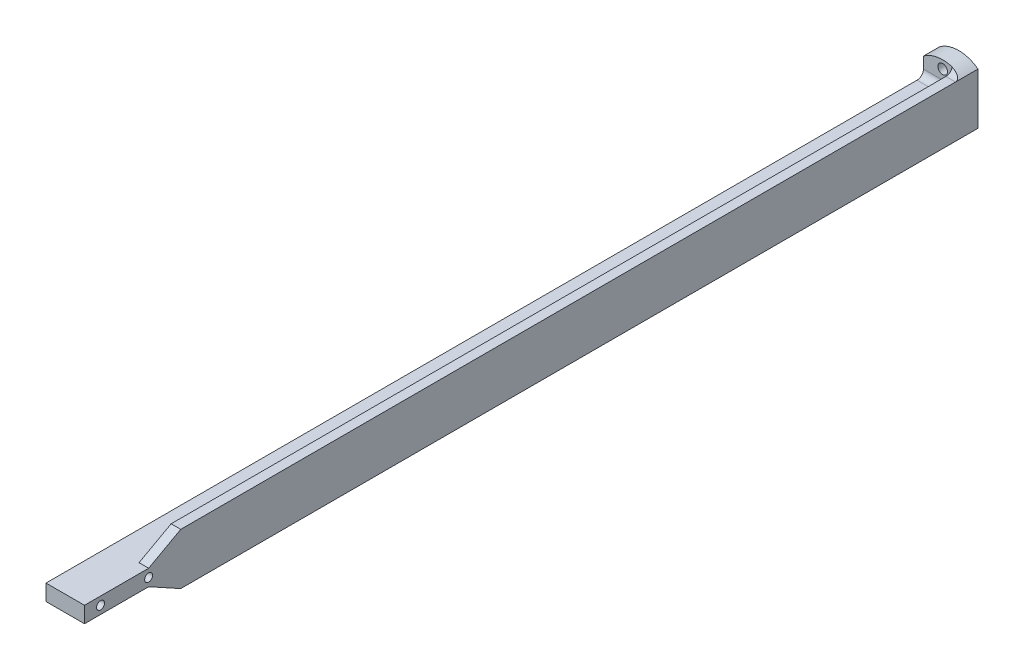
ISO-10303-21;
HEADER;
FILE_DESCRIPTION(('STEP AP214'),'2;1');
FILE_NAME('part.step','',(''),(''),'','','');
FILE_SCHEMA(('AUTOMOTIVE_DESIGN { 1 0 10303 214 1 1 1 1 }'));
ENDSEC;
DATA;
#1=APPLICATION_CONTEXT('core data for automotive mechanical design processes');
#2=APPLICATION_PROTOCOL_DEFINITION('international standard','automotive_design',2000,#1);
#3=PRODUCT_CONTEXT('',#1,'mechanical');
#4=PRODUCT('Part','Part','',(#3));
#5=PRODUCT_RELATED_PRODUCT_CATEGORY('part','',(#4));
#6=PRODUCT_DEFINITION_FORMATION('','',#4);
#7=PRODUCT_DEFINITION_CONTEXT('part definition',#1,'design');
#8=PRODUCT_DEFINITION('design','',#6,#7);
#9=PRODUCT_DEFINITION_SHAPE('','',#8);
#10=(LENGTH_UNIT() NAMED_UNIT(*) SI_UNIT(.MILLI.,.METRE.));
#11=(NAMED_UNIT(*) PLANE_ANGLE_UNIT() SI_UNIT($,.RADIAN.));
#12=(NAMED_UNIT(*) SI_UNIT($,.STERADIAN.) SOLID_ANGLE_UNIT());
#13=UNCERTAINTY_MEASURE_WITH_UNIT(LENGTH_MEASURE(1.E-05),#10,'distance_accuracy_value','');
#14=(GEOMETRIC_REPRESENTATION_CONTEXT(3) GLOBAL_UNCERTAINTY_ASSIGNED_CONTEXT((#13)) GLOBAL_UNIT_ASSIGNED_CONTEXT((#10,
#11,#12)) REPRESENTATION_CONTEXT('',''));
#15=CARTESIAN_POINT('',(0.,0.,0.));
#16=DIRECTION('',(0.,0.,1.));
#17=DIRECTION('',(1.,0.,0.));
#18=AXIS2_PLACEMENT_3D('',#15,#16,#17);
#19=CARTESIAN_POINT('',(0.,0.,10.));
#20=DIRECTION('',(0.,0.,1.));
#21=DIRECTION('',(1.,0.,0.));
#22=AXIS2_PLACEMENT_3D('',#19,#20,#21);
#23=PLANE('',#22);
#24=CARTESIAN_POINT('',(0.,2.1163626406917E-13,10.));
#25=DIRECTION('',(0.,0.,1.));
#26=DIRECTION('',(1.,0.,0.));
#27=AXIS2_PLACEMENT_3D('',#24,#25,#26);
#28=CIRCLE('',#27,20.0000000000002);
#29=CARTESIAN_POINT('',(-12.,-16.,10.));
#30=VERTEX_POINT('',#29);
#31=CARTESIAN_POINT('',(6.,-19.0787840283389,10.));
#32=VERTEX_POINT('',#31);
#33=EDGE_CURVE('E305',#30,#32,#28,.T.);
#34=ORIENTED_EDGE('',*,*,#33,.T.);
#35=DIRECTION('',(0.,-1.,0.));
#36=VECTOR('',#35,1.);
#37=CARTESIAN_POINT('',(6.,-16.,10.));
#38=LINE('',#37,#36);
#39=CARTESIAN_POINT('',(6.,-9.,10.));
#40=VERTEX_POINT('',#39);
#41=EDGE_CURVE('E260',#40,#32,#38,.T.);
#42=ORIENTED_EDGE('',*,*,#41,.F.);
#43=DIRECTION('',(1.,0.,0.));
#44=VECTOR('',#43,1.);
#45=CARTESIAN_POINT('',(0.,-9.,10.));
#46=LINE('',#45,#44);
#47=CARTESIAN_POINT('',(-12.,-9.,10.));
#48=VERTEX_POINT('',#47);
#49=EDGE_CURVE('E329',#40,#48,#46,.F.);
#50=ORIENTED_EDGE('',*,*,#49,.T.);
#51=DIRECTION('',(0.,-1.,0.));
#52=VECTOR('',#51,1.);
#53=CARTESIAN_POINT('',(-12.,-16.,10.));
#54=LINE('',#53,#52);
#55=EDGE_CURVE('E116',#48,#30,#54,.T.);
#56=ORIENTED_EDGE('',*,*,#55,.T.);
#57=EDGE_LOOP('',(#34,#42,#50,#56));
#58=FACE_BOUND('',#57,.T.);
#59=CARTESIAN_POINT('',(0.,-15.,10.));
#60=DIRECTION('',(0.,0.,1.));
#61=DIRECTION('',(-1.,0.,0.));
#62=AXIS2_PLACEMENT_3D('',#59,#60,#61);
#63=CIRCLE('',#62,3.);
#64=CARTESIAN_POINT('',(-3.,-15.,10.));
#65=VERTEX_POINT('',#64);
#66=EDGE_CURVE('E287',#65,#65,#63,.T.);
#67=ORIENTED_EDGE('',*,*,#66,.F.);
#68=EDGE_LOOP('',(#67));
#69=FACE_BOUND('',#68,.T.);
#70=ADVANCED_FACE('F33',(#58,#69),#23,.T.);
#71=DIRECTION('',(0.,-1.,0.));
#72=VECTOR('',#71,1.);
#73=CARTESIAN_POINT('',(6.,5.,10.));
#74=LINE('',#73,#72);
#75=CARTESIAN_POINT('',(6.,19.0787840283389,10.));
#76=VERTEX_POINT('',#75);
#77=CARTESIAN_POINT('',(6.,9.,10.));
#78=VERTEX_POINT('',#77);
#79=EDGE_CURVE('E240',#76,#78,#74,.T.);
#80=ORIENTED_EDGE('',*,*,#79,.F.);
#81=CARTESIAN_POINT('',(0.,0.,10.));
#82=DIRECTION('',(0.,0.,1.));
#83=DIRECTION('',(1.,0.,0.));
#84=AXIS2_PLACEMENT_3D('',#81,#82,#83);
#85=CIRCLE('',#84,20.);
#86=CARTESIAN_POINT('',(-12.,16.,10.));
#87=VERTEX_POINT('',#86);
#88=EDGE_CURVE('E299',#76,#87,#85,.T.);
#89=ORIENTED_EDGE('',*,*,#88,.T.);
#90=CARTESIAN_POINT('',(-12.,9.,10.));
#91=VERTEX_POINT('',#90);
#92=EDGE_CURVE('E303',#87,#91,#54,.T.);
#93=ORIENTED_EDGE('',*,*,#92,.T.);
#94=DIRECTION('',(-1.,0.,0.));
#95=VECTOR('',#94,1.);
#96=CARTESIAN_POINT('',(0.,9.,10.));
#97=LINE('',#96,#95);
#98=EDGE_CURVE('E78',#91,#78,#97,.F.);
#99=ORIENTED_EDGE('',*,*,#98,.T.);
#100=EDGE_LOOP('',(#80,#89,#93,#99));
#101=FACE_BOUND('',#100,.T.);
#102=CARTESIAN_POINT('',(0.,15.,10.));
#103=DIRECTION('',(0.,0.,1.));
#104=DIRECTION('',(1.,0.,0.));
#105=AXIS2_PLACEMENT_3D('',#102,#103,#104);
#106=CIRCLE('',#105,3.);
#107=CARTESIAN_POINT('',(3.,15.,10.));
#108=VERTEX_POINT('',#107);
#109=EDGE_CURVE('E293',#108,#108,#106,.T.);
#110=ORIENTED_EDGE('',*,*,#109,.F.);
#111=EDGE_LOOP('',(#110));
#112=FACE_BOUND('',#111,.T.);
#113=ADVANCED_FACE('F181',(#101,#112),#23,.T.);
#114=CARTESIAN_POINT('',(0.,0.,0.));
#115=DIRECTION('',(0.,0.,1.));
#116=DIRECTION('',(1.,0.,0.));
#117=AXIS2_PLACEMENT_3D('',#114,#115,#116);
#118=PLANE('',#117);
#119=CARTESIAN_POINT('',(0.,0.,0.));
#120=DIRECTION('',(0.,0.,1.));
#121=DIRECTION('',(1.,0.,0.));
#122=AXIS2_PLACEMENT_3D('',#119,#120,#121);
#123=CIRCLE('',#122,20.);
#124=CARTESIAN_POINT('',(12.,16.,0.));
#125=VERTEX_POINT('',#124);
#126=CARTESIAN_POINT('',(-12.,16.,0.));
#127=VERTEX_POINT('',#126);
#128=EDGE_CURVE('E296',#125,#127,#123,.T.);
#129=ORIENTED_EDGE('',*,*,#128,.F.);
#130=DIRECTION('',(0.,1.,0.));
#131=VECTOR('',#130,1.);
#132=CARTESIAN_POINT('',(12.,16.,0.));
#133=LINE('',#132,#131);
#134=CARTESIAN_POINT('',(12.,-16.,0.));
#135=VERTEX_POINT('',#134);
#136=EDGE_CURVE('E302',#135,#125,#133,.T.);
#137=ORIENTED_EDGE('',*,*,#136,.F.);
#138=CARTESIAN_POINT('',(0.,2.1163626406917E-13,0.));
#139=DIRECTION('',(0.,0.,1.));
#140=DIRECTION('',(1.,0.,0.));
#141=AXIS2_PLACEMENT_3D('',#138,#139,#140);
#142=CIRCLE('',#141,20.0000000000002);
#143=CARTESIAN_POINT('',(-12.,-16.,0.));
#144=VERTEX_POINT('',#143);
#145=EDGE_CURVE('E311',#144,#135,#142,.T.);
#146=ORIENTED_EDGE('',*,*,#145,.F.);
#147=DIRECTION('',(0.,-1.,0.));
#148=VECTOR('',#147,1.);
#149=CARTESIAN_POINT('',(-12.,-16.,0.));
#150=LINE('',#149,#148);
#151=EDGE_CURVE('E309',#127,#144,#150,.T.);
#152=ORIENTED_EDGE('',*,*,#151,.F.);
#153=EDGE_LOOP('',(#129,#137,#146,#152));
#154=FACE_BOUND('',#153,.T.);
#155=CARTESIAN_POINT('',(0.,15.,0.));
#156=DIRECTION('',(0.,0.,1.));
#157=DIRECTION('',(1.,0.,0.));
#158=AXIS2_PLACEMENT_3D('',#155,#156,#157);
#159=CIRCLE('',#158,3.);
#160=CARTESIAN_POINT('',(3.,15.,0.));
#161=VERTEX_POINT('',#160);
#162=EDGE_CURVE('E290',#161,#161,#159,.T.);
#163=ORIENTED_EDGE('',*,*,#162,.T.);
#164=EDGE_LOOP('',(#163));
#165=FACE_BOUND('',#164,.T.);
#166=CARTESIAN_POINT('',(0.,-15.,0.));
#167=DIRECTION('',(0.,0.,1.));
#168=DIRECTION('',(-1.,0.,0.));
#169=AXIS2_PLACEMENT_3D('',#166,#167,#168);
#170=CIRCLE('',#169,3.);
#171=CARTESIAN_POINT('',(-3.,-15.,0.));
#172=VERTEX_POINT('',#171);
#173=EDGE_CURVE('E286',#172,#172,#170,.T.);
#174=ORIENTED_EDGE('',*,*,#173,.T.);
#175=EDGE_LOOP('',(#174));
#176=FACE_BOUND('',#175,.T.);
#177=ADVANCED_FACE('F187',(#154,#165,#176),#118,.F.);
#178=CARTESIAN_POINT('',(0.,0.,10.));
#179=DIRECTION('',(0.,0.,-1.));
#180=DIRECTION('',(-1.,0.,0.));
#181=AXIS2_PLACEMENT_3D('',#178,#179,#180);
#182=CYLINDRICAL_SURFACE('',#181,20.);
#183=ORIENTED_EDGE('',*,*,#128,.T.);
#184=DIRECTION('',(0.,0.,-1.));
#185=VECTOR('',#184,1.);
#186=CARTESIAN_POINT('',(-12.,16.,10.));
#187=LINE('',#186,#185);
#188=EDGE_CURVE('E319',#87,#127,#187,.T.);
#189=ORIENTED_EDGE('',*,*,#188,.F.);
#190=ORIENTED_EDGE('',*,*,#88,.F.);
#191=DIRECTION('',(0.,0.,-1.));
#192=VECTOR('',#191,1.);
#193=CARTESIAN_POINT('',(6.,19.0787840283389,10.));
#194=LINE('',#193,#192);
#195=CARTESIAN_POINT('',(6.,19.0787840283389,10.1075250632077));
#196=VERTEX_POINT('',#195);
#197=EDGE_CURVE('E41',#76,#196,#194,.F.);
#198=ORIENTED_EDGE('',*,*,#197,.T.);
#199=CARTESIAN_POINT('',(6.,19.0787840283389,10.1075250632077));
#200=CARTESIAN_POINT('',(6.14633112965909,19.032766801878,10.1184247209935));
#201=CARTESIAN_POINT('',(6.29205448106545,18.9850870787186,10.1305621677016));
#202=CARTESIAN_POINT('',(6.58215284380001,18.8864693423043,10.1577760179056));
#203=CARTESIAN_POINT('',(6.72652754580666,18.8355306016269,10.1728530790805));
#204=CARTESIAN_POINT('',(7.01434559977959,18.7302570991138,10.2064769688623));
#205=CARTESIAN_POINT('',(7.15778230785818,18.6759087176826,10.2250383919108));
#206=CARTESIAN_POINT('',(7.44285501922537,18.5641421635832,10.2661214271337));
#207=CARTESIAN_POINT('',(7.58449115040891,18.5067242104716,10.2886427563316));
#208=CARTESIAN_POINT('',(8.00526070119703,18.3305166099831,10.3628167632858));
#209=CARTESIAN_POINT('',(8.28148056105142,18.2073242314995,10.4212126925757));
#210=CARTESIAN_POINT('',(8.68745046886862,18.0152892284043,10.5263566255832));
#211=CARTESIAN_POINT('',(8.82127232772068,17.9501271768432,10.5642906797343));
#212=CARTESIAN_POINT('',(9.08577017371499,17.81770514312,10.6468392579796));
#213=CARTESIAN_POINT('',(9.21644692548532,17.7504456801914,10.6914521389011));
#214=CARTESIAN_POINT('',(9.44867404066273,17.6277125535055,10.778704635907));
#215=CARTESIAN_POINT('',(9.55088499998356,17.5725312203804,10.8199975116822));
#216=CARTESIAN_POINT('',(9.75272164431196,17.46132055984,10.9080512839971));
#217=CARTESIAN_POINT('',(9.85234266169028,17.4052899554305,10.9548213155373));
#218=CARTESIAN_POINT('',(10.0592774373471,17.2866045078933,11.0598561562565));
#219=CARTESIAN_POINT('',(10.1662140002273,17.2239062034897,11.1188209107692));
#220=CARTESIAN_POINT('',(10.3753810598338,17.0987229555606,11.2449161131397));
#221=CARTESIAN_POINT('',(10.477610025964,17.0362380874591,11.31204919131));
#222=CARTESIAN_POINT('',(10.6762518219419,16.9124604003723,11.4551934060836));
#223=CARTESIAN_POINT('',(10.7726711822609,16.8511662974668,11.5311942811746));
#224=CARTESIAN_POINT('',(10.9585752828273,16.7308665038476,11.6928558616636));
#225=CARTESIAN_POINT('',(11.0480618390216,16.671860215911,11.7785140229447));
#226=CARTESIAN_POINT('',(11.2438155479259,16.5406839488857,11.9869322602985));
#227=CARTESIAN_POINT('',(11.3472641677119,16.4697544284351,12.1131899836863));
#228=CARTESIAN_POINT('',(11.5359702412646,16.3381346070125,12.3834487613467));
#229=CARTESIAN_POINT('',(11.6212502053802,16.2774316554205,12.5274275066173));
#230=CARTESIAN_POINT('',(11.756794310748,16.1797284598035,12.8068147446215));
#231=CARTESIAN_POINT('',(11.8105092705196,16.1404726092965,12.939745760501));
#232=CARTESIAN_POINT('',(11.8990686575709,16.0752985954694,13.2147780292898));
#233=CARTESIAN_POINT('',(11.9339490095424,16.0493550453141,13.3568612416897));
#234=CARTESIAN_POINT('',(11.9721100272586,16.020888575642,13.5834542760123));
#235=CARTESIAN_POINT('',(11.9825353712386,16.013087495659,13.6661718082781));
#236=CARTESIAN_POINT('',(11.9964917386914,16.0026314371031,13.8325738699668));
#237=CARTESIAN_POINT('',(12.0000171618916,15.9999806387333,13.916259129475));
#238=CARTESIAN_POINT('',(12.,16.,14.));
#239=B_SPLINE_CURVE_WITH_KNOTS('',3,(#199,#200,#201,#202,#203,#204,#205,#206,#207,#208,#209,
#210,#211,#212,#213,#214,#215,#216,#217,#218,#219,#220,#221,#222,#223,#224,#225,#226,#227,#228,
#229,#230,#231,#232,#233,#234,#235,#236,#237,#238),.UNSPECIFIED.,.F.,.F.,(4,2,2,2,2,2,2,2,2,2,2,
2,2,2,2,2,2,2,2,4),(0.,0.461342790551211,0.922788915871767,1.38621279664647,1.84960357441544,
2.77245785041094,3.23311726687214,3.6936635343067,4.06336149974157,4.4336850860846,
4.84520837592028,5.2568645343699,5.66804897631816,6.07912534778151,6.61125486788049,
7.14272121330929,7.5868822285412,8.03019304172754,8.28099298268232,8.53199639938809),.UNSPECIFIED.);
#240=CARTESIAN_POINT('',(12.,16.,14.));
#241=VERTEX_POINT('',#240);
#242=EDGE_CURVE('E144',#196,#241,#239,.T.);
#243=ORIENTED_EDGE('',*,*,#242,.T.);
#244=DIRECTION('',(0.,0.,-1.));
#245=VECTOR('',#244,1.);
#246=CARTESIAN_POINT('',(12.,16.,10.));
#247=LINE('',#246,#245);
#248=EDGE_CURVE('E56',#241,#125,#247,.T.);
#249=ORIENTED_EDGE('',*,*,#248,.T.);
#250=EDGE_LOOP('',(#183,#189,#190,#198,#243,#249));
#251=FACE_BOUND('',#250,.T.);
#252=ADVANCED_FACE('F160',(#251),#182,.T.);
#253=CARTESIAN_POINT('',(-12.,-16.,10.));
#254=DIRECTION('',(1.,0.,0.));
#255=DIRECTION('',(0.,0.,-1.));
#256=AXIS2_PLACEMENT_3D('',#253,#254,#255);
#257=PLANE('',#256);
#258=CARTESIAN_POINT('',(-12.,0.,547.));
#259=DIRECTION('',(-1.,0.,0.));
#260=DIRECTION('',(0.,0.,1.));
#261=AXIS2_PLACEMENT_3D('',#258,#259,#260);
#262=CIRCLE('',#261,2.50000000000003);
#263=CARTESIAN_POINT('',(-12.,0.,549.5));
#264=VERTEX_POINT('',#263);
#265=EDGE_CURVE('E212',#264,#264,#262,.T.);
#266=ORIENTED_EDGE('',*,*,#265,.F.);
#267=EDGE_LOOP('',(#266));
#268=FACE_BOUND('',#267,.T.);
#269=CARTESIAN_POINT('',(-12.,0.,517.));
#270=DIRECTION('',(-1.,0.,0.));
#271=DIRECTION('',(0.,0.,1.));
#272=AXIS2_PLACEMENT_3D('',#269,#270,#271);
#273=CIRCLE('',#272,2.50000000000003);
#274=CARTESIAN_POINT('',(-12.,0.,519.5));
#275=VERTEX_POINT('',#274);
#276=EDGE_CURVE('E215',#275,#275,#273,.T.);
#277=ORIENTED_EDGE('',*,*,#276,.F.);
#278=EDGE_LOOP('',(#277));
#279=FACE_BOUND('',#278,.T.);
#280=ORIENTED_EDGE('',*,*,#151,.T.);
#281=DIRECTION('',(0.,0.,-1.));
#282=VECTOR('',#281,1.);
#283=CARTESIAN_POINT('',(-12.,-16.,10.));
#284=LINE('',#283,#282);
#285=EDGE_CURVE('E316',#30,#144,#284,.T.);
#286=ORIENTED_EDGE('',*,*,#285,.F.);
#287=ORIENTED_EDGE('',*,*,#55,.F.);
#288=CARTESIAN_POINT('',(-12.,-9.,14.));
#289=DIRECTION('',(1.,0.,0.));
#290=DIRECTION('',(0.,0.,-1.));
#291=AXIS2_PLACEMENT_3D('',#288,#289,#290);
#292=CIRCLE('',#291,4.);
#293=CARTESIAN_POINT('',(-12.,-5.,14.));
#294=VERTEX_POINT('',#293);
#295=EDGE_CURVE('E106',#48,#294,#292,.T.);
#296=ORIENTED_EDGE('',*,*,#295,.T.);
#297=DIRECTION('',(0.,0.,-1.));
#298=VECTOR('',#297,1.);
#299=CARTESIAN_POINT('',(-12.,-5.,557.));
#300=LINE('',#299,#298);
#301=CARTESIAN_POINT('',(-12.,-5.,557.));
#302=VERTEX_POINT('',#301);
#303=EDGE_CURVE('E112',#302,#294,#300,.T.);
#304=ORIENTED_EDGE('',*,*,#303,.F.);
#305=DIRECTION('',(0.,-1.,0.));
#306=VECTOR('',#305,1.);
#307=CARTESIAN_POINT('',(-12.,-5.,557.));
#308=LINE('',#307,#306);
#309=CARTESIAN_POINT('',(-12.,5.,557.));
#310=VERTEX_POINT('',#309);
#311=EDGE_CURVE('E259',#310,#302,#308,.T.);
#312=ORIENTED_EDGE('',*,*,#311,.F.);
#313=DIRECTION('',(0.,0.,-1.));
#314=VECTOR('',#313,1.);
#315=CARTESIAN_POINT('',(-12.,5.,557.));
#316=LINE('',#315,#314);
#317=CARTESIAN_POINT('',(-12.,5.,14.));
#318=VERTEX_POINT('',#317);
#319=EDGE_CURVE('E131',#310,#318,#316,.T.);
#320=ORIENTED_EDGE('',*,*,#319,.T.);
#321=CARTESIAN_POINT('',(-12.,9.,14.));
#322=DIRECTION('',(1.,0.,0.));
#323=DIRECTION('',(0.,0.,-1.));
#324=AXIS2_PLACEMENT_3D('',#321,#322,#323);
#325=CIRCLE('',#324,4.);
#326=EDGE_CURVE('E120',#318,#91,#325,.T.);
#327=ORIENTED_EDGE('',*,*,#326,.T.);
#328=ORIENTED_EDGE('',*,*,#92,.F.);
#329=ORIENTED_EDGE('',*,*,#188,.T.);
#330=EDGE_LOOP('',(#280,#286,#287,#296,#304,#312,#320,#327,#328,#329));
#331=FACE_BOUND('',#330,.T.);
#332=ADVANCED_FACE('F109',(#268,#279,#331),#257,.F.);
#333=CARTESIAN_POINT('',(0.,2.1163626406917E-13,10.));
#334=DIRECTION('',(0.,0.,-1.));
#335=DIRECTION('',(-1.,0.,0.));
#336=AXIS2_PLACEMENT_3D('',#333,#334,#335);
#337=CYLINDRICAL_SURFACE('',#336,20.0000000000002);
#338=ORIENTED_EDGE('',*,*,#145,.T.);
#339=DIRECTION('',(0.,0.,-1.));
#340=VECTOR('',#339,1.);
#341=CARTESIAN_POINT('',(12.,-16.,10.));
#342=LINE('',#341,#340);
#343=CARTESIAN_POINT('',(12.,-16.,14.));
#344=VERTEX_POINT('',#343);
#345=EDGE_CURVE('E67',#344,#135,#342,.T.);
#346=ORIENTED_EDGE('',*,*,#345,.F.);
#347=CARTESIAN_POINT('',(12.,-16.,14.));
#348=CARTESIAN_POINT('',(12.0000220807342,-15.9999775362675,13.9205881507548));
#349=CARTESIAN_POINT('',(11.9968477391451,-16.0023640761224,13.8411935164768));
#350=CARTESIAN_POINT('',(11.984277467383,-16.0117833258762,13.683245368557));
#351=CARTESIAN_POINT('',(11.9748871125638,-16.0188118721885,13.6046911652055));
#352=CARTESIAN_POINT('',(11.9501787462262,-16.0372518908009,13.4498579127796));
#353=CARTESIAN_POINT('',(11.9349204953753,-16.0486191674932,13.3735640204002));
#354=CARTESIAN_POINT('',(11.8987801793178,-16.075432758928,13.2230679075067));
#355=CARTESIAN_POINT('',(11.8778972278303,-16.090879716496,13.1488660186657));
#356=CARTESIAN_POINT('',(11.8074879596281,-16.1426954928225,12.9306892745345));
#357=CARTESIAN_POINT('',(11.7500912989532,-16.1846227836268,12.7904809623071));
#358=CARTESIAN_POINT('',(11.617560985494,-16.280016852419,12.5228212855278));
#359=CARTESIAN_POINT('',(11.5423812194435,-16.3335135996502,12.3954043347446));
#360=CARTESIAN_POINT('',(11.3425432654989,-16.4732228256573,12.1031420147364));
#361=CARTESIAN_POINT('',(11.2104404866404,-16.5636727564625,11.9454258179641));
#362=CARTESIAN_POINT('',(10.9249617070258,-16.7533494709884,11.6570966622093));
#363=CARTESIAN_POINT('',(10.7715503675016,-16.8525907333912,11.5265296454575));
#364=CARTESIAN_POINT('',(10.4473466200384,-17.0554970392308,11.2880476726455));
#365=CARTESIAN_POINT('',(10.276365725774,-17.1592011744817,11.1804271254428));
#366=CARTESIAN_POINT('',(9.92284610359831,-17.3660336750871,10.9863107892011));
#367=CARTESIAN_POINT('',(9.74031297592987,-17.4691622934494,10.8998048616019));
#368=CARTESIAN_POINT('',(9.32807739198206,-17.6932945873682,10.7284706537975));
#369=CARTESIAN_POINT('',(9.09637634435014,-17.8136285227482,10.6476219261922));
#370=CARTESIAN_POINT('',(8.6233280954476,-18.0473819883305,10.5063013886976));
#371=CARTESIAN_POINT('',(8.38197116981656,-18.1607942419745,10.4458507304139));
#372=CARTESIAN_POINT('',(7.89140472656523,-18.3792828999692,10.3410407960048));
#373=CARTESIAN_POINT('',(7.64217657198651,-18.4843370647288,10.2967233979117));
#374=CARTESIAN_POINT('',(7.13813585285479,-18.6847679100756,10.2208950715891));
#375=CARTESIAN_POINT('',(6.88332619925467,-18.7801494957071,10.1893776277843));
#376=CARTESIAN_POINT('',(6.52242409192179,-18.9068799698748,10.1520754083593));
#377=CARTESIAN_POINT('',(6.41822107733547,-18.942507300103,10.1421504115495));
#378=CARTESIAN_POINT('',(6.2094505747357,-19.0119642256027,10.1237812346166));
#379=CARTESIAN_POINT('',(6.10488523359903,-19.0457990757975,10.1153325374427));
#380=CARTESIAN_POINT('',(6.,-19.0787840283389,10.1075250632077));
#381=B_SPLINE_CURVE_WITH_KNOTS('',3,(#347,#348,#349,#350,#351,#352,#353,#354,#355,#356,#357,
#358,#359,#360,#361,#362,#363,#364,#365,#366,#367,#368,#369,#370,#371,#372,#373,#374,#375,#376,
#377,#378,#379,#380),.UNSPECIFIED.,.F.,.F.,(4,2,2,2,2,2,2,2,2,2,2,2,2,2,2,2,4),(0.,
0.238108394063348,0.476003509455321,0.711537372952814,0.947108371119654,1.41624990620999,
1.88662156990726,2.55704421998495,3.22859229827952,3.90829738929478,4.5876754629201,
5.40633012528083,6.22583109457079,7.04744437210527,7.86863889711651,8.20033567605361,
8.53099907661332),.UNSPECIFIED.);
#382=CARTESIAN_POINT('',(6.,-19.0787840283389,10.1075250632077));
#383=VERTEX_POINT('',#382);
#384=EDGE_CURVE('E48',#344,#383,#381,.T.);
#385=ORIENTED_EDGE('',*,*,#384,.T.);
#386=DIRECTION('',(0.,0.,-1.));
#387=VECTOR('',#386,1.);
#388=CARTESIAN_POINT('',(6.,-19.0787840283389,10.1075250632077));
#389=LINE('',#388,#387);
#390=EDGE_CURVE('E11',#32,#383,#389,.F.);
#391=ORIENTED_EDGE('',*,*,#390,.F.);
#392=ORIENTED_EDGE('',*,*,#33,.F.);
#393=ORIENTED_EDGE('',*,*,#285,.T.);
#394=EDGE_LOOP('',(#338,#346,#385,#391,#392,#393));
#395=FACE_BOUND('',#394,.T.);
#396=ADVANCED_FACE('F199',(#395),#337,.T.);
#397=CARTESIAN_POINT('',(12.,16.,10.));
#398=DIRECTION('',(-1.,0.,0.));
#399=DIRECTION('',(0.,0.,1.));
#400=AXIS2_PLACEMENT_3D('',#397,#398,#399);
#401=PLANE('',#400);
#402=CARTESIAN_POINT('',(12.,0.,547.));
#403=DIRECTION('',(-1.,0.,0.));
#404=DIRECTION('',(0.,0.,1.));
#405=AXIS2_PLACEMENT_3D('',#402,#403,#404);
#406=CIRCLE('',#405,2.50000000000003);
#407=CARTESIAN_POINT('',(12.,0.,549.5));
#408=VERTEX_POINT('',#407);
#409=EDGE_CURVE('E217',#408,#408,#406,.T.);
#410=ORIENTED_EDGE('',*,*,#409,.T.);
#411=EDGE_LOOP('',(#410));
#412=FACE_BOUND('',#411,.T.);
#413=CARTESIAN_POINT('',(12.,0.,517.));
#414=DIRECTION('',(-1.,0.,0.));
#415=DIRECTION('',(0.,0.,1.));
#416=AXIS2_PLACEMENT_3D('',#413,#414,#415);
#417=CIRCLE('',#416,2.50000000000003);
#418=CARTESIAN_POINT('',(12.,0.,519.5));
#419=VERTEX_POINT('',#418);
#420=EDGE_CURVE('E222',#419,#419,#417,.T.);
#421=ORIENTED_EDGE('',*,*,#420,.T.);
#422=EDGE_LOOP('',(#421));
#423=FACE_BOUND('',#422,.T.);
#424=DIRECTION('',(0.,-0.481918749772157,0.876215908676647));
#425=VECTOR('',#424,1.);
#426=CARTESIAN_POINT('',(12.,16.,497.));
#427=LINE('',#426,#425);
#428=CARTESIAN_POINT('',(12.,16.,497.));
#429=VERTEX_POINT('',#428);
#430=CARTESIAN_POINT('',(12.,5.,517.));
#431=VERTEX_POINT('',#430);
#432=EDGE_CURVE('E229',#429,#431,#427,.T.);
#433=ORIENTED_EDGE('',*,*,#432,.T.);
#434=DIRECTION('',(0.,0.,1.));
#435=VECTOR('',#434,1.);
#436=CARTESIAN_POINT('',(12.,5.,517.));
#437=LINE('',#436,#435);
#438=CARTESIAN_POINT('',(12.,5.,557.));
#439=VERTEX_POINT('',#438);
#440=EDGE_CURVE('E226',#431,#439,#437,.T.);
#441=ORIENTED_EDGE('',*,*,#440,.T.);
#442=DIRECTION('',(0.,1.,0.));
#443=VECTOR('',#442,1.);
#444=CARTESIAN_POINT('',(12.,16.,557.));
#445=LINE('',#444,#443);
#446=CARTESIAN_POINT('',(12.,-5.,557.));
#447=VERTEX_POINT('',#446);
#448=EDGE_CURVE('E264',#447,#439,#445,.T.);
#449=ORIENTED_EDGE('',*,*,#448,.F.);
#450=DIRECTION('',(0.,0.,-1.));
#451=VECTOR('',#450,1.);
#452=CARTESIAN_POINT('',(12.,-5.,517.));
#453=LINE('',#452,#451);
#454=CARTESIAN_POINT('',(12.,-5.,517.));
#455=VERTEX_POINT('',#454);
#456=EDGE_CURVE('E243',#447,#455,#453,.T.);
#457=ORIENTED_EDGE('',*,*,#456,.T.);
#458=DIRECTION('',(0.,-0.481918749772156,-0.876215908676647));
#459=VECTOR('',#458,1.);
#460=CARTESIAN_POINT('',(12.,-16.,497.));
#461=LINE('',#460,#459);
#462=CARTESIAN_POINT('',(12.,-16.,497.));
#463=VERTEX_POINT('',#462);
#464=EDGE_CURVE('E246',#455,#463,#461,.T.);
#465=ORIENTED_EDGE('',*,*,#464,.T.);
#466=DIRECTION('',(0.,0.,-1.));
#467=VECTOR('',#466,1.);
#468=CARTESIAN_POINT('',(12.,-16.,557.));
#469=LINE('',#468,#467);
#470=EDGE_CURVE('E271',#463,#344,#469,.T.);
#471=ORIENTED_EDGE('',*,*,#470,.T.);
#472=ORIENTED_EDGE('',*,*,#345,.T.);
#473=ORIENTED_EDGE('',*,*,#136,.T.);
#474=ORIENTED_EDGE('',*,*,#248,.F.);
#475=DIRECTION('',(0.,0.,-1.));
#476=VECTOR('',#475,1.);
#477=CARTESIAN_POINT('',(12.,16.,557.));
#478=LINE('',#477,#476);
#479=EDGE_CURVE('E267',#429,#241,#478,.T.);
#480=ORIENTED_EDGE('',*,*,#479,.F.);
#481=EDGE_LOOP('',(#433,#441,#449,#457,#465,#471,#472,#473,#474,#480));
#482=FACE_BOUND('',#481,.T.);
#483=ADVANCED_FACE('F197',(#412,#423,#482),#401,.F.);
#484=CARTESIAN_POINT('',(0.,15.,10.));
#485=DIRECTION('',(0.,0.,-1.));
#486=DIRECTION('',(-1.,0.,0.));
#487=AXIS2_PLACEMENT_3D('',#484,#485,#486);
#488=CYLINDRICAL_SURFACE('',#487,3.);
#489=ORIENTED_EDGE('',*,*,#109,.T.);
#490=EDGE_LOOP('',(#489));
#491=FACE_BOUND('',#490,.T.);
#492=ORIENTED_EDGE('',*,*,#162,.F.);
#493=EDGE_LOOP('',(#492));
#494=FACE_BOUND('',#493,.T.);
#495=ADVANCED_FACE('F192',(#491,#494),#488,.F.);
#496=CARTESIAN_POINT('',(0.,-15.,10.));
#497=DIRECTION('',(0.,0.,-1.));
#498=DIRECTION('',(-1.,0.,0.));
#499=AXIS2_PLACEMENT_3D('',#496,#497,#498);
#500=CYLINDRICAL_SURFACE('',#499,3.);
#501=ORIENTED_EDGE('',*,*,#66,.T.);
#502=EDGE_LOOP('',(#501));
#503=FACE_BOUND('',#502,.T.);
#504=ORIENTED_EDGE('',*,*,#173,.F.);
#505=EDGE_LOOP('',(#504));
#506=FACE_BOUND('',#505,.T.);
#507=ADVANCED_FACE('F442',(#503,#506),#500,.F.);
#508=CARTESIAN_POINT('',(6.,16.,557.));
#509=DIRECTION('',(0.,-1.,0.));
#510=DIRECTION('',(0.,0.,-1.));
#511=AXIS2_PLACEMENT_3D('',#508,#509,#510);
#512=PLANE('',#511);
#513=ORIENTED_EDGE('',*,*,#479,.T.);
#514=DIRECTION('',(-1.,0.,0.));
#515=VECTOR('',#514,1.);
#516=CARTESIAN_POINT('',(6.,16.,14.));
#517=LINE('',#516,#515);
#518=CARTESIAN_POINT('',(6.,16.,14.));
#519=VERTEX_POINT('',#518);
#520=EDGE_CURVE('E322',#241,#519,#517,.T.);
#521=ORIENTED_EDGE('',*,*,#520,.T.);
#522=DIRECTION('',(0.,0.,-1.));
#523=VECTOR('',#522,1.);
#524=CARTESIAN_POINT('',(6.,16.,557.));
#525=LINE('',#524,#523);
#526=CARTESIAN_POINT('',(6.,16.,497.));
#527=VERTEX_POINT('',#526);
#528=EDGE_CURVE('E283',#527,#519,#525,.T.);
#529=ORIENTED_EDGE('',*,*,#528,.F.);
#530=DIRECTION('',(-1.,0.,0.));
#531=VECTOR('',#530,1.);
#532=CARTESIAN_POINT('',(12.,16.,497.));
#533=LINE('',#532,#531);
#534=EDGE_CURVE('E233',#429,#527,#533,.T.);
#535=ORIENTED_EDGE('',*,*,#534,.F.);
#536=EDGE_LOOP('',(#513,#521,#529,#535));
#537=FACE_BOUND('',#536,.T.);
#538=ADVANCED_FACE('F415',(#537),#512,.F.);
#539=CARTESIAN_POINT('',(6.,5.,557.));
#540=DIRECTION('',(1.,0.,0.));
#541=DIRECTION('',(0.,0.,-1.));
#542=AXIS2_PLACEMENT_3D('',#539,#540,#541);
#543=PLANE('',#542);
#544=ORIENTED_EDGE('',*,*,#79,.T.);
#545=CARTESIAN_POINT('',(6.,9.,14.));
#546=DIRECTION('',(1.,0.,0.));
#547=DIRECTION('',(0.,0.,-1.));
#548=AXIS2_PLACEMENT_3D('',#545,#546,#547);
#549=CIRCLE('',#548,4.);
#550=CARTESIAN_POINT('',(6.,5.,14.));
#551=VERTEX_POINT('',#550);
#552=EDGE_CURVE('E135',#78,#551,#549,.F.);
#553=ORIENTED_EDGE('',*,*,#552,.T.);
#554=DIRECTION('',(0.,0.,-1.));
#555=VECTOR('',#554,1.);
#556=CARTESIAN_POINT('',(6.,5.,557.));
#557=LINE('',#556,#555);
#558=CARTESIAN_POINT('',(6.,5.,517.));
#559=VERTEX_POINT('',#558);
#560=EDGE_CURVE('E280',#559,#551,#557,.T.);
#561=ORIENTED_EDGE('',*,*,#560,.F.);
#562=DIRECTION('',(0.,-0.481918749772157,0.876215908676647));
#563=VECTOR('',#562,1.);
#564=CARTESIAN_POINT('',(6.,16.,497.));
#565=LINE('',#564,#563);
#566=EDGE_CURVE('E230',#527,#559,#565,.T.);
#567=ORIENTED_EDGE('',*,*,#566,.F.);
#568=ORIENTED_EDGE('',*,*,#528,.T.);
#569=CARTESIAN_POINT('',(6.,20.,14.));
#570=DIRECTION('',(1.,0.,0.));
#571=DIRECTION('',(0.,0.,-1.));
#572=AXIS2_PLACEMENT_3D('',#569,#570,#571);
#573=CIRCLE('',#572,4.);
#574=EDGE_CURVE('E137',#519,#196,#573,.T.);
#575=ORIENTED_EDGE('',*,*,#574,.T.);
#576=ORIENTED_EDGE('',*,*,#197,.F.);
#577=EDGE_LOOP('',(#544,#553,#561,#567,#568,#575,#576));
#578=FACE_BOUND('',#577,.T.);
#579=ADVANCED_FACE('F368',(#578),#543,.F.);
#580=CARTESIAN_POINT('',(-12.,5.,557.));
#581=DIRECTION('',(0.,-1.,0.));
#582=DIRECTION('',(0.,0.,-1.));
#583=AXIS2_PLACEMENT_3D('',#580,#581,#582);
#584=PLANE('',#583);
#585=ORIENTED_EDGE('',*,*,#560,.T.);
#586=DIRECTION('',(-1.,0.,0.));
#587=VECTOR('',#586,1.);
#588=CARTESIAN_POINT('',(-12.,5.,14.));
#589=LINE('',#588,#587);
#590=EDGE_CURVE('E139',#551,#318,#589,.T.);
#591=ORIENTED_EDGE('',*,*,#590,.T.);
#592=ORIENTED_EDGE('',*,*,#319,.F.);
#593=DIRECTION('',(-1.,0.,0.));
#594=VECTOR('',#593,1.);
#595=CARTESIAN_POINT('',(-12.,5.,557.));
#596=LINE('',#595,#594);
#597=EDGE_CURVE('E256',#439,#310,#596,.T.);
#598=ORIENTED_EDGE('',*,*,#597,.F.);
#599=ORIENTED_EDGE('',*,*,#440,.F.);
#600=DIRECTION('',(-1.,0.,0.));
#601=VECTOR('',#600,1.);
#602=CARTESIAN_POINT('',(12.,5.,517.));
#603=LINE('',#602,#601);
#604=EDGE_CURVE('E237',#431,#559,#603,.T.);
#605=ORIENTED_EDGE('',*,*,#604,.T.);
#606=EDGE_LOOP('',(#585,#591,#592,#598,#599,#605));
#607=FACE_BOUND('',#606,.T.);
#608=ADVANCED_FACE('F334',(#607),#584,.F.);
#609=CARTESIAN_POINT('',(6.,-5.,557.));
#610=DIRECTION('',(0.,1.,0.));
#611=DIRECTION('',(0.,0.,1.));
#612=AXIS2_PLACEMENT_3D('',#609,#610,#611);
#613=PLANE('',#612);
#614=ORIENTED_EDGE('',*,*,#303,.T.);
#615=DIRECTION('',(1.,0.,0.));
#616=VECTOR('',#615,1.);
#617=CARTESIAN_POINT('',(6.,-5.,14.));
#618=LINE('',#617,#616);
#619=CARTESIAN_POINT('',(6.,-5.,14.));
#620=VERTEX_POINT('',#619);
#621=EDGE_CURVE('E126',#294,#620,#618,.T.);
#622=ORIENTED_EDGE('',*,*,#621,.T.);
#623=DIRECTION('',(0.,0.,-1.));
#624=VECTOR('',#623,1.);
#625=CARTESIAN_POINT('',(6.,-5.,557.));
#626=LINE('',#625,#624);
#627=CARTESIAN_POINT('',(6.,-5.,517.));
#628=VERTEX_POINT('',#627);
#629=EDGE_CURVE('E132',#628,#620,#626,.T.);
#630=ORIENTED_EDGE('',*,*,#629,.F.);
#631=DIRECTION('',(-1.,0.,0.));
#632=VECTOR('',#631,1.);
#633=CARTESIAN_POINT('',(12.,-5.,517.));
#634=LINE('',#633,#632);
#635=EDGE_CURVE('E249',#455,#628,#634,.T.);
#636=ORIENTED_EDGE('',*,*,#635,.F.);
#637=ORIENTED_EDGE('',*,*,#456,.F.);
#638=DIRECTION('',(1.,0.,0.));
#639=VECTOR('',#638,1.);
#640=CARTESIAN_POINT('',(6.,-5.,557.));
#641=LINE('',#640,#639);
#642=EDGE_CURVE('E130',#302,#447,#641,.T.);
#643=ORIENTED_EDGE('',*,*,#642,.F.);
#644=EDGE_LOOP('',(#614,#622,#630,#636,#637,#643));
#645=FACE_BOUND('',#644,.T.);
#646=ADVANCED_FACE('F124',(#645),#613,.F.);
#647=CARTESIAN_POINT('',(6.,-16.,557.));
#648=DIRECTION('',(1.,0.,0.));
#649=DIRECTION('',(0.,0.,-1.));
#650=AXIS2_PLACEMENT_3D('',#647,#648,#649);
#651=PLANE('',#650);
#652=ORIENTED_EDGE('',*,*,#629,.T.);
#653=CARTESIAN_POINT('',(6.,-9.,14.));
#654=DIRECTION('',(1.,0.,0.));
#655=DIRECTION('',(0.,0.,-1.));
#656=AXIS2_PLACEMENT_3D('',#653,#654,#655);
#657=CIRCLE('',#656,4.);
#658=EDGE_CURVE('E134',#620,#40,#657,.F.);
#659=ORIENTED_EDGE('',*,*,#658,.T.);
#660=ORIENTED_EDGE('',*,*,#41,.T.);
#661=ORIENTED_EDGE('',*,*,#390,.T.);
#662=CARTESIAN_POINT('',(6.,-20.,14.));
#663=DIRECTION('',(1.,0.,0.));
#664=DIRECTION('',(0.,0.,-1.));
#665=AXIS2_PLACEMENT_3D('',#662,#663,#664);
#666=CIRCLE('',#665,4.);
#667=CARTESIAN_POINT('',(6.,-16.,14.));
#668=VERTEX_POINT('',#667);
#669=EDGE_CURVE('E405',#383,#668,#666,.T.);
#670=ORIENTED_EDGE('',*,*,#669,.T.);
#671=DIRECTION('',(0.,0.,-1.));
#672=VECTOR('',#671,1.);
#673=CARTESIAN_POINT('',(6.,-16.,557.));
#674=LINE('',#673,#672);
#675=CARTESIAN_POINT('',(6.,-16.,497.));
#676=VERTEX_POINT('',#675);
#677=EDGE_CURVE('E274',#676,#668,#674,.T.);
#678=ORIENTED_EDGE('',*,*,#677,.F.);
#679=DIRECTION('',(0.,-0.481918749772156,-0.876215908676647));
#680=VECTOR('',#679,1.);
#681=CARTESIAN_POINT('',(6.,-16.,497.));
#682=LINE('',#681,#680);
#683=EDGE_CURVE('E219',#628,#676,#682,.T.);
#684=ORIENTED_EDGE('',*,*,#683,.F.);
#685=EDGE_LOOP('',(#652,#659,#660,#661,#670,#678,#684));
#686=FACE_BOUND('',#685,.T.);
#687=ADVANCED_FACE('F403',(#686),#651,.F.);
#688=CARTESIAN_POINT('',(12.,-16.,557.));
#689=DIRECTION('',(0.,1.,0.));
#690=DIRECTION('',(0.,0.,1.));
#691=AXIS2_PLACEMENT_3D('',#688,#689,#690);
#692=PLANE('',#691);
#693=ORIENTED_EDGE('',*,*,#677,.T.);
#694=DIRECTION('',(1.,0.,0.));
#695=VECTOR('',#694,1.);
#696=CARTESIAN_POINT('',(12.,-16.,14.));
#697=LINE('',#696,#695);
#698=EDGE_CURVE('E326',#668,#344,#697,.T.);
#699=ORIENTED_EDGE('',*,*,#698,.T.);
#700=ORIENTED_EDGE('',*,*,#470,.F.);
#701=DIRECTION('',(-1.,0.,0.));
#702=VECTOR('',#701,1.);
#703=CARTESIAN_POINT('',(12.,-16.,497.));
#704=LINE('',#703,#702);
#705=EDGE_CURVE('E236',#463,#676,#704,.T.);
#706=ORIENTED_EDGE('',*,*,#705,.T.);
#707=EDGE_LOOP('',(#693,#699,#700,#706));
#708=FACE_BOUND('',#707,.T.);
#709=ADVANCED_FACE('F401',(#708),#692,.F.);
#710=CARTESIAN_POINT('',(0.,0.,557.));
#711=DIRECTION('',(0.,0.,-1.));
#712=DIRECTION('',(-1.,0.,0.));
#713=AXIS2_PLACEMENT_3D('',#710,#711,#712);
#714=PLANE('',#713);
#715=ORIENTED_EDGE('',*,*,#448,.T.);
#716=ORIENTED_EDGE('',*,*,#597,.T.);
#717=ORIENTED_EDGE('',*,*,#311,.T.);
#718=ORIENTED_EDGE('',*,*,#642,.T.);
#719=EDGE_LOOP('',(#715,#716,#717,#718));
#720=FACE_BOUND('',#719,.T.);
#721=ADVANCED_FACE('F342',(#720),#714,.F.);
#722=CARTESIAN_POINT('',(12.,-16.,497.));
#723=DIRECTION('',(0.,0.876215908676647,-0.481918749772156));
#724=DIRECTION('',(0.,0.481918749772156,0.876215908676647));
#725=AXIS2_PLACEMENT_3D('',#722,#723,#724);
#726=PLANE('',#725);
#727=ORIENTED_EDGE('',*,*,#683,.T.);
#728=ORIENTED_EDGE('',*,*,#705,.F.);
#729=ORIENTED_EDGE('',*,*,#464,.F.);
#730=ORIENTED_EDGE('',*,*,#635,.T.);
#731=EDGE_LOOP('',(#727,#728,#729,#730));
#732=FACE_BOUND('',#731,.T.);
#733=ADVANCED_FACE('F395',(#732),#726,.F.);
#734=CARTESIAN_POINT('',(12.,16.,497.));
#735=DIRECTION('',(0.,-0.876215908676647,-0.481918749772156));
#736=DIRECTION('',(0.,0.481918749772157,-0.876215908676647));
#737=AXIS2_PLACEMENT_3D('',#734,#735,#736);
#738=PLANE('',#737);
#739=ORIENTED_EDGE('',*,*,#566,.T.);
#740=ORIENTED_EDGE('',*,*,#604,.F.);
#741=ORIENTED_EDGE('',*,*,#432,.F.);
#742=ORIENTED_EDGE('',*,*,#534,.T.);
#743=EDGE_LOOP('',(#739,#740,#741,#742));
#744=FACE_BOUND('',#743,.T.);
#745=ADVANCED_FACE('F167',(#744),#738,.F.);
#746=CARTESIAN_POINT('',(6.,20.,14.));
#747=DIRECTION('',(-1.,0.,0.));
#748=DIRECTION('',(0.,0.,1.));
#749=AXIS2_PLACEMENT_3D('',#746,#747,#748);
#750=CYLINDRICAL_SURFACE('',#749,4.);
#751=ORIENTED_EDGE('',*,*,#520,.F.);
#752=ORIENTED_EDGE('',*,*,#242,.F.);
#753=ORIENTED_EDGE('',*,*,#574,.F.);
#754=EDGE_LOOP('',(#751,#752,#753));
#755=FACE_BOUND('',#754,.T.);
#756=ADVANCED_FACE('F163',(#755),#750,.F.);
#757=CARTESIAN_POINT('',(12.,-20.,14.));
#758=DIRECTION('',(1.,0.,0.));
#759=DIRECTION('',(0.,0.,-1.));
#760=AXIS2_PLACEMENT_3D('',#757,#758,#759);
#761=CYLINDRICAL_SURFACE('',#760,4.);
#762=ORIENTED_EDGE('',*,*,#669,.F.);
#763=ORIENTED_EDGE('',*,*,#384,.F.);
#764=ORIENTED_EDGE('',*,*,#698,.F.);
#765=EDGE_LOOP('',(#762,#763,#764));
#766=FACE_BOUND('',#765,.T.);
#767=ADVANCED_FACE('F166',(#766),#761,.F.);
#768=CARTESIAN_POINT('',(-12.,9.,14.));
#769=DIRECTION('',(-1.,0.,0.));
#770=DIRECTION('',(0.,0.,1.));
#771=AXIS2_PLACEMENT_3D('',#768,#769,#770);
#772=CYLINDRICAL_SURFACE('',#771,4.);
#773=ORIENTED_EDGE('',*,*,#552,.F.);
#774=ORIENTED_EDGE('',*,*,#98,.F.);
#775=ORIENTED_EDGE('',*,*,#326,.F.);
#776=ORIENTED_EDGE('',*,*,#590,.F.);
#777=EDGE_LOOP('',(#773,#774,#775,#776));
#778=FACE_BOUND('',#777,.T.);
#779=ADVANCED_FACE('F171',(#778),#772,.F.);
#780=CARTESIAN_POINT('',(6.,-9.,14.));
#781=DIRECTION('',(1.,0.,0.));
#782=DIRECTION('',(0.,0.,-1.));
#783=AXIS2_PLACEMENT_3D('',#780,#781,#782);
#784=CYLINDRICAL_SURFACE('',#783,4.);
#785=ORIENTED_EDGE('',*,*,#295,.F.);
#786=ORIENTED_EDGE('',*,*,#49,.F.);
#787=ORIENTED_EDGE('',*,*,#658,.F.);
#788=ORIENTED_EDGE('',*,*,#621,.F.);
#789=EDGE_LOOP('',(#785,#786,#787,#788));
#790=FACE_BOUND('',#789,.T.);
#791=ADVANCED_FACE('F35',(#790),#784,.F.);
#792=CARTESIAN_POINT('',(0.,0.,517.));
#793=DIRECTION('',(-1.,0.,0.));
#794=DIRECTION('',(0.,0.,1.));
#795=AXIS2_PLACEMENT_3D('',#792,#793,#794);
#796=CYLINDRICAL_SURFACE('',#795,2.50000000000003);
#797=ORIENTED_EDGE('',*,*,#276,.T.);
#798=EDGE_LOOP('',(#797));
#799=FACE_BOUND('',#798,.T.);
#800=ORIENTED_EDGE('',*,*,#420,.F.);
#801=EDGE_LOOP('',(#800));
#802=FACE_BOUND('',#801,.T.);
#803=ADVANCED_FACE('F178',(#799,#802),#796,.F.);
#804=CARTESIAN_POINT('',(0.,0.,547.));
#805=DIRECTION('',(-1.,0.,0.));
#806=DIRECTION('',(0.,0.,1.));
#807=AXIS2_PLACEMENT_3D('',#804,#805,#806);
#808=CYLINDRICAL_SURFACE('',#807,2.50000000000003);
#809=ORIENTED_EDGE('',*,*,#265,.T.);
#810=EDGE_LOOP('',(#809));
#811=FACE_BOUND('',#810,.T.);
#812=ORIENTED_EDGE('',*,*,#409,.F.);
#813=EDGE_LOOP('',(#812));
#814=FACE_BOUND('',#813,.T.);
#815=ADVANCED_FACE('F591',(#811,#814),#808,.F.);
#816=CLOSED_SHELL('',(#70,#113,#177,#252,#332,#396,#483,#495,#507,#538,#579,#608,#646,#687,#709,
#721,#733,#745,#756,#767,#779,#791,#803,#815));
#817=MANIFOLD_SOLID_BREP('B2',#816);
#818=ADVANCED_BREP_SHAPE_REPRESENTATION('',(#18,#817),#14);
#819=SHAPE_DEFINITION_REPRESENTATION(#9,#818);
ENDSEC;
END-ISO-10303-21;
